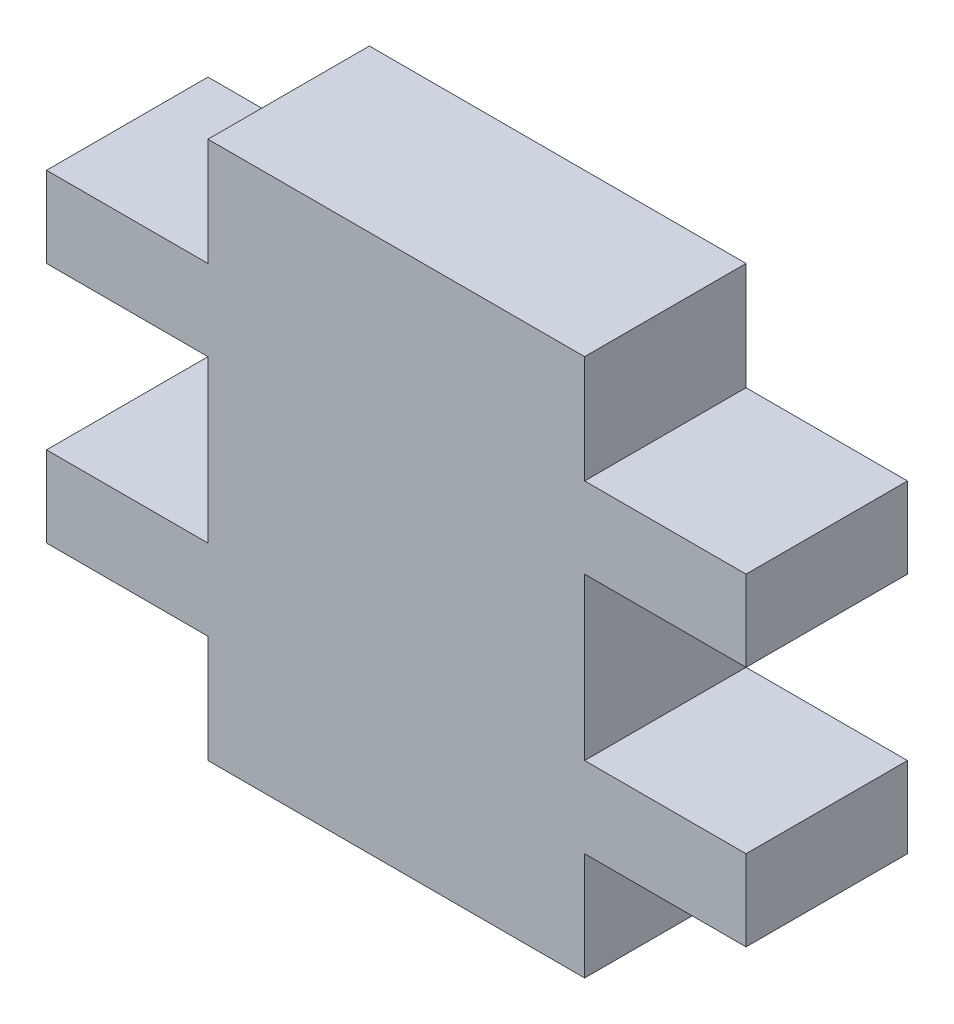
ISO-10303-21;
HEADER;
FILE_DESCRIPTION(('STEP AP214'),'2;1');
FILE_NAME('part.step','',(''),(''),'','','');
FILE_SCHEMA(('AUTOMOTIVE_DESIGN { 1 0 10303 214 1 1 1 1 }'));
ENDSEC;
DATA;
#1=APPLICATION_CONTEXT('core data for automotive mechanical design processes');
#2=APPLICATION_PROTOCOL_DEFINITION('international standard','automotive_design',2000,#1);
#3=PRODUCT_CONTEXT('',#1,'mechanical');
#4=PRODUCT('Part','Part','',(#3));
#5=PRODUCT_RELATED_PRODUCT_CATEGORY('part','',(#4));
#6=PRODUCT_DEFINITION_FORMATION('','',#4);
#7=PRODUCT_DEFINITION_CONTEXT('part definition',#1,'design');
#8=PRODUCT_DEFINITION('design','',#6,#7);
#9=PRODUCT_DEFINITION_SHAPE('','',#8);
#10=(LENGTH_UNIT() NAMED_UNIT(*) SI_UNIT(.MILLI.,.METRE.));
#11=(NAMED_UNIT(*) PLANE_ANGLE_UNIT() SI_UNIT($,.RADIAN.));
#12=(NAMED_UNIT(*) SI_UNIT($,.STERADIAN.) SOLID_ANGLE_UNIT());
#13=UNCERTAINTY_MEASURE_WITH_UNIT(LENGTH_MEASURE(1.E-05),#10,'distance_accuracy_value','');
#14=(GEOMETRIC_REPRESENTATION_CONTEXT(3) GLOBAL_UNCERTAINTY_ASSIGNED_CONTEXT((#13)) GLOBAL_UNIT_ASSIGNED_CONTEXT((#10,
#11,#12)) REPRESENTATION_CONTEXT('',''));
#15=CARTESIAN_POINT('',(0.,0.,0.));
#16=DIRECTION('',(0.,0.,1.));
#17=DIRECTION('',(1.,0.,0.));
#18=AXIS2_PLACEMENT_3D('',#15,#16,#17);
#19=CARTESIAN_POINT('',(6.5,-5.,3.));
#20=DIRECTION('',(-1.,0.,0.));
#21=DIRECTION('',(0.,0.,1.));
#22=AXIS2_PLACEMENT_3D('',#19,#20,#21);
#23=PLANE('',#22);
#24=DIRECTION('',(0.,1.,0.));
#25=VECTOR('',#24,1.);
#26=CARTESIAN_POINT('',(6.5,-5.,0.));
#27=LINE('',#26,#25);
#28=CARTESIAN_POINT('',(6.5,-3.,0.));
#29=VERTEX_POINT('',#28);
#30=CARTESIAN_POINT('',(6.5,-1.5,0.));
#31=VERTEX_POINT('',#30);
#32=EDGE_CURVE('E322',#29,#31,#27,.T.);
#33=ORIENTED_EDGE('',*,*,#32,.T.);
#34=DIRECTION('',(0.,0.,1.));
#35=VECTOR('',#34,1.);
#36=CARTESIAN_POINT('',(6.5,-1.5,0.));
#37=LINE('',#36,#35);
#38=CARTESIAN_POINT('',(6.5,-1.5,3.));
#39=VERTEX_POINT('',#38);
#40=EDGE_CURVE('E218',#31,#39,#37,.T.);
#41=ORIENTED_EDGE('',*,*,#40,.T.);
#42=DIRECTION('',(0.,1.,0.));
#43=VECTOR('',#42,1.);
#44=CARTESIAN_POINT('',(6.5,-5.,3.));
#45=LINE('',#44,#43);
#46=CARTESIAN_POINT('',(6.5,-3.,3.));
#47=VERTEX_POINT('',#46);
#48=EDGE_CURVE('E315',#47,#39,#45,.T.);
#49=ORIENTED_EDGE('',*,*,#48,.F.);
#50=DIRECTION('',(0.,0.,1.));
#51=VECTOR('',#50,1.);
#52=CARTESIAN_POINT('',(6.5,-3.,0.));
#53=LINE('',#52,#51);
#54=EDGE_CURVE('E235',#29,#47,#53,.T.);
#55=ORIENTED_EDGE('',*,*,#54,.F.);
#56=EDGE_LOOP('',(#33,#41,#49,#55));
#57=FACE_BOUND('',#56,.T.);
#58=ADVANCED_FACE('F39',(#57),#23,.F.);
#59=CARTESIAN_POINT('',(-6.5,-5.,3.));
#60=DIRECTION('',(1.,0.,0.));
#61=DIRECTION('',(0.,0.,-1.));
#62=AXIS2_PLACEMENT_3D('',#59,#60,#61);
#63=PLANE('',#62);
#64=DIRECTION('',(0.,-1.,0.));
#65=VECTOR('',#64,1.);
#66=CARTESIAN_POINT('',(-6.5,-5.,3.));
#67=LINE('',#66,#65);
#68=CARTESIAN_POINT('',(-6.5,3.,3.));
#69=VERTEX_POINT('',#68);
#70=CARTESIAN_POINT('',(-6.5,1.5,3.));
#71=VERTEX_POINT('',#70);
#72=EDGE_CURVE('E48',#69,#71,#67,.T.);
#73=ORIENTED_EDGE('',*,*,#72,.F.);
#74=DIRECTION('',(0.,0.,1.));
#75=VECTOR('',#74,1.);
#76=CARTESIAN_POINT('',(-6.5,3.,0.));
#77=LINE('',#76,#75);
#78=CARTESIAN_POINT('',(-6.5,3.,0.));
#79=VERTEX_POINT('',#78);
#80=EDGE_CURVE('E256',#79,#69,#77,.T.);
#81=ORIENTED_EDGE('',*,*,#80,.F.);
#82=DIRECTION('',(0.,-1.,0.));
#83=VECTOR('',#82,1.);
#84=CARTESIAN_POINT('',(-6.5,-5.,0.));
#85=LINE('',#84,#83);
#86=CARTESIAN_POINT('',(-6.5,1.5,0.));
#87=VERTEX_POINT('',#86);
#88=EDGE_CURVE('E325',#79,#87,#85,.T.);
#89=ORIENTED_EDGE('',*,*,#88,.T.);
#90=DIRECTION('',(0.,0.,1.));
#91=VECTOR('',#90,1.);
#92=CARTESIAN_POINT('',(-6.5,1.5,0.));
#93=LINE('',#92,#91);
#94=EDGE_CURVE('E277',#87,#71,#93,.T.);
#95=ORIENTED_EDGE('',*,*,#94,.T.);
#96=EDGE_LOOP('',(#73,#81,#89,#95));
#97=FACE_BOUND('',#96,.T.);
#98=ADVANCED_FACE('F370',(#97),#63,.F.);
#99=CARTESIAN_POINT('',(6.5,1.5,0.));
#100=VERTEX_POINT('',#99);
#101=CARTESIAN_POINT('',(6.5,3.,0.));
#102=VERTEX_POINT('',#101);
#103=EDGE_CURVE('E266',#100,#102,#27,.T.);
#104=ORIENTED_EDGE('',*,*,#103,.T.);
#105=DIRECTION('',(0.,0.,1.));
#106=VECTOR('',#105,1.);
#107=CARTESIAN_POINT('',(6.5,3.,0.));
#108=LINE('',#107,#106);
#109=CARTESIAN_POINT('',(6.5,3.,3.));
#110=VERTEX_POINT('',#109);
#111=EDGE_CURVE('E187',#102,#110,#108,.T.);
#112=ORIENTED_EDGE('',*,*,#111,.T.);
#113=CARTESIAN_POINT('',(6.5,1.5,3.));
#114=VERTEX_POINT('',#113);
#115=EDGE_CURVE('E312',#114,#110,#45,.T.);
#116=ORIENTED_EDGE('',*,*,#115,.F.);
#117=DIRECTION('',(0.,0.,1.));
#118=VECTOR('',#117,1.);
#119=CARTESIAN_POINT('',(6.5,1.5,0.));
#120=LINE('',#119,#118);
#121=EDGE_CURVE('E211',#100,#114,#120,.T.);
#122=ORIENTED_EDGE('',*,*,#121,.F.);
#123=EDGE_LOOP('',(#104,#112,#116,#122));
#124=FACE_BOUND('',#123,.T.);
#125=ADVANCED_FACE('F41',(#124),#23,.F.);
#126=CARTESIAN_POINT('',(-6.5,5.,3.));
#127=DIRECTION('',(0.,-1.,0.));
#128=DIRECTION('',(0.,0.,-1.));
#129=AXIS2_PLACEMENT_3D('',#126,#127,#128);
#130=PLANE('',#129);
#131=DIRECTION('',(-1.,0.,0.));
#132=VECTOR('',#131,1.);
#133=CARTESIAN_POINT('',(-6.5,5.,3.));
#134=LINE('',#133,#132);
#135=CARTESIAN_POINT('',(3.5,5.,3.));
#136=VERTEX_POINT('',#135);
#137=CARTESIAN_POINT('',(-3.5,5.,3.));
#138=VERTEX_POINT('',#137);
#139=EDGE_CURVE('E316',#136,#138,#134,.T.);
#140=ORIENTED_EDGE('',*,*,#139,.F.);
#141=DIRECTION('',(0.,0.,1.));
#142=VECTOR('',#141,1.);
#143=CARTESIAN_POINT('',(3.5,5.,0.));
#144=LINE('',#143,#142);
#145=CARTESIAN_POINT('',(3.5,5.,0.));
#146=VERTEX_POINT('',#145);
#147=EDGE_CURVE('E207',#146,#136,#144,.T.);
#148=ORIENTED_EDGE('',*,*,#147,.F.);
#149=DIRECTION('',(-1.,0.,0.));
#150=VECTOR('',#149,1.);
#151=CARTESIAN_POINT('',(-6.5,5.,0.));
#152=LINE('',#151,#150);
#153=CARTESIAN_POINT('',(-3.5,5.,0.));
#154=VERTEX_POINT('',#153);
#155=EDGE_CURVE('E200',#146,#154,#152,.T.);
#156=ORIENTED_EDGE('',*,*,#155,.T.);
#157=DIRECTION('',(0.,0.,1.));
#158=VECTOR('',#157,1.);
#159=CARTESIAN_POINT('',(-3.5,5.,0.));
#160=LINE('',#159,#158);
#161=EDGE_CURVE('E263',#154,#138,#160,.T.);
#162=ORIENTED_EDGE('',*,*,#161,.T.);
#163=EDGE_LOOP('',(#140,#148,#156,#162));
#164=FACE_BOUND('',#163,.T.);
#165=ADVANCED_FACE('F377',(#164),#130,.F.);
#166=CARTESIAN_POINT('',(-6.5,-1.5,3.));
#167=VERTEX_POINT('',#166);
#168=CARTESIAN_POINT('',(-6.5,-3.,3.));
#169=VERTEX_POINT('',#168);
#170=EDGE_CURVE('E318',#167,#169,#67,.T.);
#171=ORIENTED_EDGE('',*,*,#170,.F.);
#172=DIRECTION('',(0.,0.,1.));
#173=VECTOR('',#172,1.);
#174=CARTESIAN_POINT('',(-6.5,-1.5,0.));
#175=LINE('',#174,#173);
#176=CARTESIAN_POINT('',(-6.5,-1.5,0.));
#177=VERTEX_POINT('',#176);
#178=EDGE_CURVE('E270',#177,#167,#175,.T.);
#179=ORIENTED_EDGE('',*,*,#178,.F.);
#180=CARTESIAN_POINT('',(-6.5,-3.,0.));
#181=VERTEX_POINT('',#180);
#182=EDGE_CURVE('E323',#177,#181,#85,.T.);
#183=ORIENTED_EDGE('',*,*,#182,.T.);
#184=DIRECTION('',(0.,0.,1.));
#185=VECTOR('',#184,1.);
#186=CARTESIAN_POINT('',(-6.5,-3.,0.));
#187=LINE('',#186,#185);
#188=EDGE_CURVE('E209',#181,#169,#187,.T.);
#189=ORIENTED_EDGE('',*,*,#188,.T.);
#190=EDGE_LOOP('',(#171,#179,#183,#189));
#191=FACE_BOUND('',#190,.T.);
#192=ADVANCED_FACE('F376',(#191),#63,.F.);
#193=CARTESIAN_POINT('',(-6.5,-5.,3.));
#194=DIRECTION('',(0.,1.,0.));
#195=DIRECTION('',(0.,0.,1.));
#196=AXIS2_PLACEMENT_3D('',#193,#194,#195);
#197=PLANE('',#196);
#198=DIRECTION('',(1.,0.,0.));
#199=VECTOR('',#198,1.);
#200=CARTESIAN_POINT('',(-6.5,-5.,0.));
#201=LINE('',#200,#199);
#202=CARTESIAN_POINT('',(-3.5,-5.,0.));
#203=VERTEX_POINT('',#202);
#204=CARTESIAN_POINT('',(3.5,-5.,0.));
#205=VERTEX_POINT('',#204);
#206=EDGE_CURVE('E43',#203,#205,#201,.T.);
#207=ORIENTED_EDGE('',*,*,#206,.T.);
#208=DIRECTION('',(0.,0.,1.));
#209=VECTOR('',#208,1.);
#210=CARTESIAN_POINT('',(3.5,-5.,0.));
#211=LINE('',#210,#209);
#212=CARTESIAN_POINT('',(3.5,-5.,3.));
#213=VERTEX_POINT('',#212);
#214=EDGE_CURVE('E239',#205,#213,#211,.T.);
#215=ORIENTED_EDGE('',*,*,#214,.T.);
#216=DIRECTION('',(1.,0.,0.));
#217=VECTOR('',#216,1.);
#218=CARTESIAN_POINT('',(-6.5,-5.,3.));
#219=LINE('',#218,#217);
#220=CARTESIAN_POINT('',(-3.5,-5.,3.));
#221=VERTEX_POINT('',#220);
#222=EDGE_CURVE('E11',#221,#213,#219,.T.);
#223=ORIENTED_EDGE('',*,*,#222,.F.);
#224=DIRECTION('',(0.,0.,1.));
#225=VECTOR('',#224,1.);
#226=CARTESIAN_POINT('',(-3.5,-5.,0.));
#227=LINE('',#226,#225);
#228=EDGE_CURVE('E296',#203,#221,#227,.T.);
#229=ORIENTED_EDGE('',*,*,#228,.F.);
#230=EDGE_LOOP('',(#207,#215,#223,#229));
#231=FACE_BOUND('',#230,.T.);
#232=ADVANCED_FACE('F337',(#231),#197,.F.);
#233=CARTESIAN_POINT('',(0.,0.,3.));
#234=DIRECTION('',(0.,0.,-1.));
#235=DIRECTION('',(-1.,0.,0.));
#236=AXIS2_PLACEMENT_3D('',#233,#234,#235);
#237=PLANE('',#236);
#238=DIRECTION('',(1.,0.,0.));
#239=VECTOR('',#238,1.);
#240=CARTESIAN_POINT('',(3.5,3.,3.));
#241=LINE('',#240,#239);
#242=CARTESIAN_POINT('',(3.5,3.,3.));
#243=VERTEX_POINT('',#242);
#244=EDGE_CURVE('E201',#243,#110,#241,.T.);
#245=ORIENTED_EDGE('',*,*,#244,.F.);
#246=DIRECTION('',(0.,-1.,0.));
#247=VECTOR('',#246,1.);
#248=CARTESIAN_POINT('',(3.5,5.,3.));
#249=LINE('',#248,#247);
#250=EDGE_CURVE('E184',#136,#243,#249,.T.);
#251=ORIENTED_EDGE('',*,*,#250,.F.);
#252=ORIENTED_EDGE('',*,*,#139,.T.);
#253=DIRECTION('',(0.,1.,0.));
#254=VECTOR('',#253,1.);
#255=CARTESIAN_POINT('',(-3.5,3.,3.));
#256=LINE('',#255,#254);
#257=CARTESIAN_POINT('',(-3.5,3.,3.));
#258=VERTEX_POINT('',#257);
#259=EDGE_CURVE('E254',#258,#138,#256,.T.);
#260=ORIENTED_EDGE('',*,*,#259,.F.);
#261=DIRECTION('',(1.,0.,0.));
#262=VECTOR('',#261,1.);
#263=CARTESIAN_POINT('',(-6.5,3.,3.));
#264=LINE('',#263,#262);
#265=EDGE_CURVE('E257',#69,#258,#264,.T.);
#266=ORIENTED_EDGE('',*,*,#265,.F.);
#267=ORIENTED_EDGE('',*,*,#72,.T.);
#268=DIRECTION('',(-1.,0.,0.));
#269=VECTOR('',#268,1.);
#270=CARTESIAN_POINT('',(-6.5,1.5,3.));
#271=LINE('',#270,#269);
#272=CARTESIAN_POINT('',(-3.5,1.5,3.));
#273=VERTEX_POINT('',#272);
#274=EDGE_CURVE('E281',#273,#71,#271,.T.);
#275=ORIENTED_EDGE('',*,*,#274,.F.);
#276=DIRECTION('',(0.,1.,0.));
#277=VECTOR('',#276,1.);
#278=CARTESIAN_POINT('',(-3.5,1.5,3.));
#279=LINE('',#278,#277);
#280=CARTESIAN_POINT('',(-3.5,-1.5,3.));
#281=VERTEX_POINT('',#280);
#282=EDGE_CURVE('E283',#281,#273,#279,.T.);
#283=ORIENTED_EDGE('',*,*,#282,.F.);
#284=DIRECTION('',(1.,0.,0.));
#285=VECTOR('',#284,1.);
#286=CARTESIAN_POINT('',(-6.5,-1.5,3.));
#287=LINE('',#286,#285);
#288=EDGE_CURVE('E260',#167,#281,#287,.T.);
#289=ORIENTED_EDGE('',*,*,#288,.F.);
#290=ORIENTED_EDGE('',*,*,#170,.T.);
#291=DIRECTION('',(-1.,0.,0.));
#292=VECTOR('',#291,1.);
#293=CARTESIAN_POINT('',(-6.5,-3.,3.));
#294=LINE('',#293,#292);
#295=CARTESIAN_POINT('',(-3.5,-3.,3.));
#296=VERTEX_POINT('',#295);
#297=EDGE_CURVE('E303',#296,#169,#294,.T.);
#298=ORIENTED_EDGE('',*,*,#297,.F.);
#299=DIRECTION('',(0.,1.,0.));
#300=VECTOR('',#299,1.);
#301=CARTESIAN_POINT('',(-3.5,-3.,3.));
#302=LINE('',#301,#300);
#303=EDGE_CURVE('E280',#221,#296,#302,.T.);
#304=ORIENTED_EDGE('',*,*,#303,.F.);
#305=ORIENTED_EDGE('',*,*,#222,.T.);
#306=DIRECTION('',(0.,-1.,0.));
#307=VECTOR('',#306,1.);
#308=CARTESIAN_POINT('',(3.5,-3.,3.));
#309=LINE('',#308,#307);
#310=CARTESIAN_POINT('',(3.5,-3.,3.));
#311=VERTEX_POINT('',#310);
#312=EDGE_CURVE('E242',#311,#213,#309,.T.);
#313=ORIENTED_EDGE('',*,*,#312,.F.);
#314=DIRECTION('',(-1.,0.,0.));
#315=VECTOR('',#314,1.);
#316=CARTESIAN_POINT('',(6.5,-3.,3.));
#317=LINE('',#316,#315);
#318=EDGE_CURVE('E221',#47,#311,#317,.T.);
#319=ORIENTED_EDGE('',*,*,#318,.F.);
#320=ORIENTED_EDGE('',*,*,#48,.T.);
#321=DIRECTION('',(1.,0.,0.));
#322=VECTOR('',#321,1.);
#323=CARTESIAN_POINT('',(6.5,-1.5,3.));
#324=LINE('',#323,#322);
#325=CARTESIAN_POINT('',(3.5,-1.5,3.));
#326=VERTEX_POINT('',#325);
#327=EDGE_CURVE('E222',#326,#39,#324,.T.);
#328=ORIENTED_EDGE('',*,*,#327,.F.);
#329=DIRECTION('',(0.,-1.,0.));
#330=VECTOR('',#329,1.);
#331=CARTESIAN_POINT('',(3.5,1.5,3.));
#332=LINE('',#331,#330);
#333=CARTESIAN_POINT('',(3.5,1.5,3.));
#334=VERTEX_POINT('',#333);
#335=EDGE_CURVE('E224',#334,#326,#332,.T.);
#336=ORIENTED_EDGE('',*,*,#335,.F.);
#337=DIRECTION('',(-1.,0.,0.));
#338=VECTOR('',#337,1.);
#339=CARTESIAN_POINT('',(6.5,1.5,3.));
#340=LINE('',#339,#338);
#341=EDGE_CURVE('E205',#114,#334,#340,.T.);
#342=ORIENTED_EDGE('',*,*,#341,.F.);
#343=ORIENTED_EDGE('',*,*,#115,.T.);
#344=EDGE_LOOP('',(#245,#251,#252,#260,#266,#267,#275,#283,#289,#290,#298,#304,#305,#313,#319,
#320,#328,#336,#342,#343));
#345=FACE_BOUND('',#344,.T.);
#346=ADVANCED_FACE('F350',(#345),#237,.F.);
#347=CARTESIAN_POINT('',(0.,0.,0.));
#348=DIRECTION('',(0.,0.,-1.));
#349=DIRECTION('',(-1.,0.,0.));
#350=AXIS2_PLACEMENT_3D('',#347,#348,#349);
#351=PLANE('',#350);
#352=DIRECTION('',(0.,-1.,0.));
#353=VECTOR('',#352,1.);
#354=CARTESIAN_POINT('',(3.5,5.,0.));
#355=LINE('',#354,#353);
#356=CARTESIAN_POINT('',(3.5,3.,0.));
#357=VERTEX_POINT('',#356);
#358=EDGE_CURVE('E181',#146,#357,#355,.T.);
#359=ORIENTED_EDGE('',*,*,#358,.T.);
#360=DIRECTION('',(1.,0.,0.));
#361=VECTOR('',#360,1.);
#362=CARTESIAN_POINT('',(3.5,3.,0.));
#363=LINE('',#362,#361);
#364=EDGE_CURVE('E188',#357,#102,#363,.T.);
#365=ORIENTED_EDGE('',*,*,#364,.T.);
#366=ORIENTED_EDGE('',*,*,#103,.F.);
#367=DIRECTION('',(-1.,0.,0.));
#368=VECTOR('',#367,1.);
#369=CARTESIAN_POINT('',(6.5,1.5,0.));
#370=LINE('',#369,#368);
#371=CARTESIAN_POINT('',(3.5,1.5,0.));
#372=VERTEX_POINT('',#371);
#373=EDGE_CURVE('E225',#100,#372,#370,.T.);
#374=ORIENTED_EDGE('',*,*,#373,.T.);
#375=DIRECTION('',(0.,-1.,0.));
#376=VECTOR('',#375,1.);
#377=CARTESIAN_POINT('',(3.5,1.5,0.));
#378=LINE('',#377,#376);
#379=CARTESIAN_POINT('',(3.5,-1.5,0.));
#380=VERTEX_POINT('',#379);
#381=EDGE_CURVE('E56',#372,#380,#378,.T.);
#382=ORIENTED_EDGE('',*,*,#381,.T.);
#383=DIRECTION('',(1.,0.,0.));
#384=VECTOR('',#383,1.);
#385=CARTESIAN_POINT('',(6.5,-1.5,0.));
#386=LINE('',#385,#384);
#387=EDGE_CURVE('E213',#380,#31,#386,.T.);
#388=ORIENTED_EDGE('',*,*,#387,.T.);
#389=ORIENTED_EDGE('',*,*,#32,.F.);
#390=DIRECTION('',(-1.,0.,0.));
#391=VECTOR('',#390,1.);
#392=CARTESIAN_POINT('',(6.5,-3.,0.));
#393=LINE('',#392,#391);
#394=CARTESIAN_POINT('',(3.5,-3.,0.));
#395=VERTEX_POINT('',#394);
#396=EDGE_CURVE('E244',#29,#395,#393,.T.);
#397=ORIENTED_EDGE('',*,*,#396,.T.);
#398=DIRECTION('',(0.,-1.,0.));
#399=VECTOR('',#398,1.);
#400=CARTESIAN_POINT('',(3.5,-3.,0.));
#401=LINE('',#400,#399);
#402=EDGE_CURVE('E64',#395,#205,#401,.T.);
#403=ORIENTED_EDGE('',*,*,#402,.T.);
#404=ORIENTED_EDGE('',*,*,#206,.F.);
#405=DIRECTION('',(0.,1.,0.));
#406=VECTOR('',#405,1.);
#407=CARTESIAN_POINT('',(-3.5,-3.,0.));
#408=LINE('',#407,#406);
#409=CARTESIAN_POINT('',(-3.5,-3.,0.));
#410=VERTEX_POINT('',#409);
#411=EDGE_CURVE('E305',#203,#410,#408,.T.);
#412=ORIENTED_EDGE('',*,*,#411,.T.);
#413=DIRECTION('',(-1.,0.,0.));
#414=VECTOR('',#413,1.);
#415=CARTESIAN_POINT('',(-6.5,-3.,0.));
#416=LINE('',#415,#414);
#417=EDGE_CURVE('E298',#410,#181,#416,.T.);
#418=ORIENTED_EDGE('',*,*,#417,.T.);
#419=ORIENTED_EDGE('',*,*,#182,.F.);
#420=DIRECTION('',(1.,0.,0.));
#421=VECTOR('',#420,1.);
#422=CARTESIAN_POINT('',(-6.5,-1.5,0.));
#423=LINE('',#422,#421);
#424=CARTESIAN_POINT('',(-3.5,-1.5,0.));
#425=VERTEX_POINT('',#424);
#426=EDGE_CURVE('E284',#177,#425,#423,.T.);
#427=ORIENTED_EDGE('',*,*,#426,.T.);
#428=DIRECTION('',(0.,1.,0.));
#429=VECTOR('',#428,1.);
#430=CARTESIAN_POINT('',(-3.5,1.5,0.));
#431=LINE('',#430,#429);
#432=CARTESIAN_POINT('',(-3.5,1.5,0.));
#433=VERTEX_POINT('',#432);
#434=EDGE_CURVE('E291',#425,#433,#431,.T.);
#435=ORIENTED_EDGE('',*,*,#434,.T.);
#436=DIRECTION('',(-1.,0.,0.));
#437=VECTOR('',#436,1.);
#438=CARTESIAN_POINT('',(-6.5,1.5,0.));
#439=LINE('',#438,#437);
#440=EDGE_CURVE('E272',#433,#87,#439,.T.);
#441=ORIENTED_EDGE('',*,*,#440,.T.);
#442=ORIENTED_EDGE('',*,*,#88,.F.);
#443=DIRECTION('',(1.,0.,0.));
#444=VECTOR('',#443,1.);
#445=CARTESIAN_POINT('',(-6.5,3.,0.));
#446=LINE('',#445,#444);
#447=CARTESIAN_POINT('',(-3.5,3.,0.));
#448=VERTEX_POINT('',#447);
#449=EDGE_CURVE('E250',#79,#448,#446,.T.);
#450=ORIENTED_EDGE('',*,*,#449,.T.);
#451=DIRECTION('',(0.,1.,0.));
#452=VECTOR('',#451,1.);
#453=CARTESIAN_POINT('',(-3.5,3.,0.));
#454=LINE('',#453,#452);
#455=EDGE_CURVE('E253',#448,#154,#454,.T.);
#456=ORIENTED_EDGE('',*,*,#455,.T.);
#457=ORIENTED_EDGE('',*,*,#155,.F.);
#458=EDGE_LOOP('',(#359,#365,#366,#374,#382,#388,#389,#397,#403,#404,#412,#418,#419,#427,#435,
#441,#442,#450,#456,#457));
#459=FACE_BOUND('',#458,.T.);
#460=ADVANCED_FACE('F198',(#459),#351,.T.);
#461=CARTESIAN_POINT('',(-6.5,-3.,0.));
#462=DIRECTION('',(0.,1.,0.));
#463=DIRECTION('',(0.,0.,1.));
#464=AXIS2_PLACEMENT_3D('',#461,#462,#463);
#465=PLANE('',#464);
#466=ORIENTED_EDGE('',*,*,#297,.T.);
#467=ORIENTED_EDGE('',*,*,#188,.F.);
#468=ORIENTED_EDGE('',*,*,#417,.F.);
#469=DIRECTION('',(0.,0.,1.));
#470=VECTOR('',#469,1.);
#471=CARTESIAN_POINT('',(-3.5,-3.,0.));
#472=LINE('',#471,#470);
#473=EDGE_CURVE('E299',#410,#296,#472,.T.);
#474=ORIENTED_EDGE('',*,*,#473,.T.);
#475=EDGE_LOOP('',(#466,#467,#468,#474));
#476=FACE_BOUND('',#475,.T.);
#477=ADVANCED_FACE('F412',(#476),#465,.F.);
#478=CARTESIAN_POINT('',(-3.5,-3.,0.));
#479=DIRECTION('',(1.,0.,0.));
#480=DIRECTION('',(0.,1.,0.));
#481=AXIS2_PLACEMENT_3D('',#478,#479,#480);
#482=PLANE('',#481);
#483=ORIENTED_EDGE('',*,*,#303,.T.);
#484=ORIENTED_EDGE('',*,*,#473,.F.);
#485=ORIENTED_EDGE('',*,*,#411,.F.);
#486=ORIENTED_EDGE('',*,*,#228,.T.);
#487=EDGE_LOOP('',(#483,#484,#485,#486));
#488=FACE_BOUND('',#487,.T.);
#489=ADVANCED_FACE('F415',(#488),#482,.F.);
#490=CARTESIAN_POINT('',(-6.5,1.5,0.));
#491=DIRECTION('',(0.,1.,0.));
#492=DIRECTION('',(0.,0.,1.));
#493=AXIS2_PLACEMENT_3D('',#490,#491,#492);
#494=PLANE('',#493);
#495=ORIENTED_EDGE('',*,*,#274,.T.);
#496=ORIENTED_EDGE('',*,*,#94,.F.);
#497=ORIENTED_EDGE('',*,*,#440,.F.);
#498=DIRECTION('',(0.,0.,1.));
#499=VECTOR('',#498,1.);
#500=CARTESIAN_POINT('',(-3.5,1.5,0.));
#501=LINE('',#500,#499);
#502=EDGE_CURVE('E275',#433,#273,#501,.T.);
#503=ORIENTED_EDGE('',*,*,#502,.T.);
#504=EDGE_LOOP('',(#495,#496,#497,#503));
#505=FACE_BOUND('',#504,.T.);
#506=ADVANCED_FACE('F402',(#505),#494,.F.);
#507=CARTESIAN_POINT('',(-3.5,1.5,0.));
#508=DIRECTION('',(1.,0.,0.));
#509=DIRECTION('',(0.,1.,0.));
#510=AXIS2_PLACEMENT_3D('',#507,#508,#509);
#511=PLANE('',#510);
#512=ORIENTED_EDGE('',*,*,#282,.T.);
#513=ORIENTED_EDGE('',*,*,#502,.F.);
#514=ORIENTED_EDGE('',*,*,#434,.F.);
#515=DIRECTION('',(0.,0.,1.));
#516=VECTOR('',#515,1.);
#517=CARTESIAN_POINT('',(-3.5,-1.5,0.));
#518=LINE('',#517,#516);
#519=EDGE_CURVE('E273',#425,#281,#518,.T.);
#520=ORIENTED_EDGE('',*,*,#519,.T.);
#521=EDGE_LOOP('',(#512,#513,#514,#520));
#522=FACE_BOUND('',#521,.T.);
#523=ADVANCED_FACE('F405',(#522),#511,.F.);
#524=CARTESIAN_POINT('',(-6.5,-1.5,0.));
#525=DIRECTION('',(0.,-1.,0.));
#526=DIRECTION('',(0.,0.,-1.));
#527=AXIS2_PLACEMENT_3D('',#524,#525,#526);
#528=PLANE('',#527);
#529=ORIENTED_EDGE('',*,*,#288,.T.);
#530=ORIENTED_EDGE('',*,*,#519,.F.);
#531=ORIENTED_EDGE('',*,*,#426,.F.);
#532=ORIENTED_EDGE('',*,*,#178,.T.);
#533=EDGE_LOOP('',(#529,#530,#531,#532));
#534=FACE_BOUND('',#533,.T.);
#535=ADVANCED_FACE('F408',(#534),#528,.F.);
#536=CARTESIAN_POINT('',(-3.5,3.,0.));
#537=DIRECTION('',(1.,0.,0.));
#538=DIRECTION('',(0.,0.,-1.));
#539=AXIS2_PLACEMENT_3D('',#536,#537,#538);
#540=PLANE('',#539);
#541=ORIENTED_EDGE('',*,*,#259,.T.);
#542=ORIENTED_EDGE('',*,*,#161,.F.);
#543=ORIENTED_EDGE('',*,*,#455,.F.);
#544=DIRECTION('',(0.,0.,1.));
#545=VECTOR('',#544,1.);
#546=CARTESIAN_POINT('',(-3.5,3.,0.));
#547=LINE('',#546,#545);
#548=EDGE_CURVE('E267',#448,#258,#547,.T.);
#549=ORIENTED_EDGE('',*,*,#548,.T.);
#550=EDGE_LOOP('',(#541,#542,#543,#549));
#551=FACE_BOUND('',#550,.T.);
#552=ADVANCED_FACE('F365',(#551),#540,.F.);
#553=CARTESIAN_POINT('',(-6.5,3.,0.));
#554=DIRECTION('',(0.,-1.,0.));
#555=DIRECTION('',(0.,0.,-1.));
#556=AXIS2_PLACEMENT_3D('',#553,#554,#555);
#557=PLANE('',#556);
#558=ORIENTED_EDGE('',*,*,#265,.T.);
#559=ORIENTED_EDGE('',*,*,#548,.F.);
#560=ORIENTED_EDGE('',*,*,#449,.F.);
#561=ORIENTED_EDGE('',*,*,#80,.T.);
#562=EDGE_LOOP('',(#558,#559,#560,#561));
#563=FACE_BOUND('',#562,.T.);
#564=ADVANCED_FACE('F356',(#563),#557,.F.);
#565=CARTESIAN_POINT('',(3.5,-3.,0.));
#566=DIRECTION('',(-1.,0.,0.));
#567=DIRECTION('',(0.,-1.,0.));
#568=AXIS2_PLACEMENT_3D('',#565,#566,#567);
#569=PLANE('',#568);
#570=ORIENTED_EDGE('',*,*,#312,.T.);
#571=ORIENTED_EDGE('',*,*,#214,.F.);
#572=ORIENTED_EDGE('',*,*,#402,.F.);
#573=DIRECTION('',(0.,0.,1.));
#574=VECTOR('',#573,1.);
#575=CARTESIAN_POINT('',(3.5,-3.,0.));
#576=LINE('',#575,#574);
#577=EDGE_CURVE('E237',#395,#311,#576,.T.);
#578=ORIENTED_EDGE('',*,*,#577,.T.);
#579=EDGE_LOOP('',(#570,#571,#572,#578));
#580=FACE_BOUND('',#579,.T.);
#581=ADVANCED_FACE('F354',(#580),#569,.F.);
#582=CARTESIAN_POINT('',(6.5,-3.,0.));
#583=DIRECTION('',(0.,1.,0.));
#584=DIRECTION('',(-1.,0.,0.));
#585=AXIS2_PLACEMENT_3D('',#582,#583,#584);
#586=PLANE('',#585);
#587=ORIENTED_EDGE('',*,*,#318,.T.);
#588=ORIENTED_EDGE('',*,*,#577,.F.);
#589=ORIENTED_EDGE('',*,*,#396,.F.);
#590=ORIENTED_EDGE('',*,*,#54,.T.);
#591=EDGE_LOOP('',(#587,#588,#589,#590));
#592=FACE_BOUND('',#591,.T.);
#593=ADVANCED_FACE('F343',(#592),#586,.F.);
#594=CARTESIAN_POINT('',(6.5,-1.5,0.));
#595=DIRECTION('',(0.,-1.,0.));
#596=DIRECTION('',(0.,0.,-1.));
#597=AXIS2_PLACEMENT_3D('',#594,#595,#596);
#598=PLANE('',#597);
#599=ORIENTED_EDGE('',*,*,#327,.T.);
#600=ORIENTED_EDGE('',*,*,#40,.F.);
#601=ORIENTED_EDGE('',*,*,#387,.F.);
#602=DIRECTION('',(0.,0.,1.));
#603=VECTOR('',#602,1.);
#604=CARTESIAN_POINT('',(3.5,-1.5,0.));
#605=LINE('',#604,#603);
#606=EDGE_CURVE('E216',#380,#326,#605,.T.);
#607=ORIENTED_EDGE('',*,*,#606,.T.);
#608=EDGE_LOOP('',(#599,#600,#601,#607));
#609=FACE_BOUND('',#608,.T.);
#610=ADVANCED_FACE('F362',(#609),#598,.F.);
#611=CARTESIAN_POINT('',(3.5,1.5,0.));
#612=DIRECTION('',(-1.,0.,0.));
#613=DIRECTION('',(0.,-1.,0.));
#614=AXIS2_PLACEMENT_3D('',#611,#612,#613);
#615=PLANE('',#614);
#616=ORIENTED_EDGE('',*,*,#335,.T.);
#617=ORIENTED_EDGE('',*,*,#606,.F.);
#618=ORIENTED_EDGE('',*,*,#381,.F.);
#619=DIRECTION('',(0.,0.,1.));
#620=VECTOR('',#619,1.);
#621=CARTESIAN_POINT('',(3.5,1.5,0.));
#622=LINE('',#621,#620);
#623=EDGE_CURVE('E214',#372,#334,#622,.T.);
#624=ORIENTED_EDGE('',*,*,#623,.T.);
#625=EDGE_LOOP('',(#616,#617,#618,#624));
#626=FACE_BOUND('',#625,.T.);
#627=ADVANCED_FACE('F388',(#626),#615,.F.);
#628=CARTESIAN_POINT('',(6.5,1.5,0.));
#629=DIRECTION('',(0.,1.,0.));
#630=DIRECTION('',(-1.,0.,0.));
#631=AXIS2_PLACEMENT_3D('',#628,#629,#630);
#632=PLANE('',#631);
#633=ORIENTED_EDGE('',*,*,#341,.T.);
#634=ORIENTED_EDGE('',*,*,#623,.F.);
#635=ORIENTED_EDGE('',*,*,#373,.F.);
#636=ORIENTED_EDGE('',*,*,#121,.T.);
#637=EDGE_LOOP('',(#633,#634,#635,#636));
#638=FACE_BOUND('',#637,.T.);
#639=ADVANCED_FACE('F386',(#638),#632,.F.);
#640=CARTESIAN_POINT('',(3.5,5.,0.));
#641=DIRECTION('',(-1.,0.,0.));
#642=DIRECTION('',(0.,-1.,0.));
#643=AXIS2_PLACEMENT_3D('',#640,#641,#642);
#644=PLANE('',#643);
#645=ORIENTED_EDGE('',*,*,#250,.T.);
#646=DIRECTION('',(0.,0.,1.));
#647=VECTOR('',#646,1.);
#648=CARTESIAN_POINT('',(3.5,3.,0.));
#649=LINE('',#648,#647);
#650=EDGE_CURVE('E177',#357,#243,#649,.T.);
#651=ORIENTED_EDGE('',*,*,#650,.F.);
#652=ORIENTED_EDGE('',*,*,#358,.F.);
#653=ORIENTED_EDGE('',*,*,#147,.T.);
#654=EDGE_LOOP('',(#645,#651,#652,#653));
#655=FACE_BOUND('',#654,.T.);
#656=ADVANCED_FACE('F179',(#655),#644,.F.);
#657=CARTESIAN_POINT('',(3.5,3.,0.));
#658=DIRECTION('',(0.,-1.,0.));
#659=DIRECTION('',(0.,0.,-1.));
#660=AXIS2_PLACEMENT_3D('',#657,#658,#659);
#661=PLANE('',#660);
#662=ORIENTED_EDGE('',*,*,#244,.T.);
#663=ORIENTED_EDGE('',*,*,#111,.F.);
#664=ORIENTED_EDGE('',*,*,#364,.F.);
#665=ORIENTED_EDGE('',*,*,#650,.T.);
#666=EDGE_LOOP('',(#662,#663,#664,#665));
#667=FACE_BOUND('',#666,.T.);
#668=ADVANCED_FACE('F191',(#667),#661,.F.);
#669=CLOSED_SHELL('',(#58,#98,#125,#165,#192,#232,#346,#460,#477,#489,#506,#523,#535,#552,#564,
#581,#593,#610,#627,#639,#656,#668));
#670=MANIFOLD_SOLID_BREP('B2',#669);
#671=ADVANCED_BREP_SHAPE_REPRESENTATION('',(#18,#670),#14);
#672=SHAPE_DEFINITION_REPRESENTATION(#9,#671);
ENDSEC;
END-ISO-10303-21;
